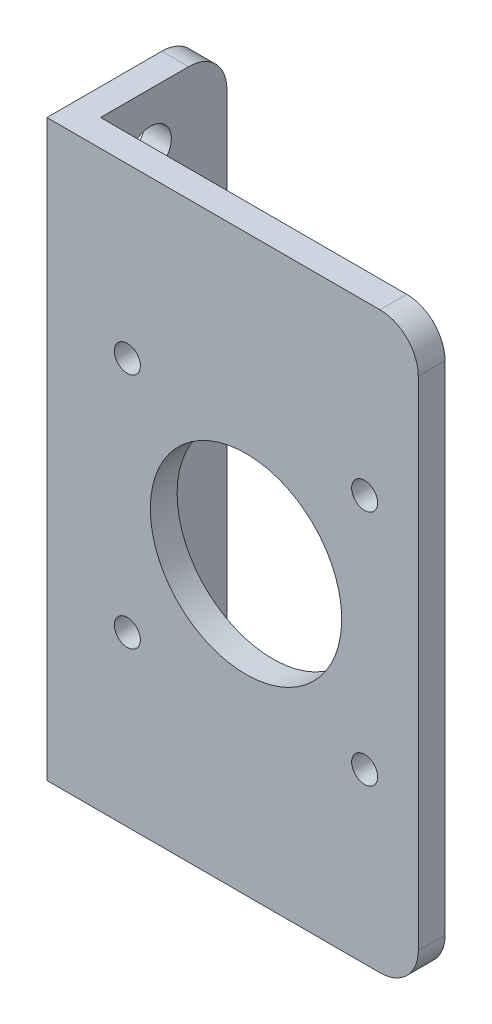
ISO-10303-21;
HEADER;
FILE_DESCRIPTION(('STEP AP214'),'2;1');
FILE_NAME('part.step','',(''),(''),'','','');
FILE_SCHEMA(('AUTOMOTIVE_DESIGN { 1 0 10303 214 1 1 1 1 }'));
ENDSEC;
DATA;
#1=APPLICATION_CONTEXT('core data for automotive mechanical design processes');
#2=APPLICATION_PROTOCOL_DEFINITION('international standard','automotive_design',2000,#1);
#3=PRODUCT_CONTEXT('',#1,'mechanical');
#4=PRODUCT('Part','Part','',(#3));
#5=PRODUCT_RELATED_PRODUCT_CATEGORY('part','',(#4));
#6=PRODUCT_DEFINITION_FORMATION('','',#4);
#7=PRODUCT_DEFINITION_CONTEXT('part definition',#1,'design');
#8=PRODUCT_DEFINITION('design','',#6,#7);
#9=PRODUCT_DEFINITION_SHAPE('','',#8);
#10=(LENGTH_UNIT() NAMED_UNIT(*) SI_UNIT(.MILLI.,.METRE.));
#11=(NAMED_UNIT(*) PLANE_ANGLE_UNIT() SI_UNIT($,.RADIAN.));
#12=(NAMED_UNIT(*) SI_UNIT($,.STERADIAN.) SOLID_ANGLE_UNIT());
#13=UNCERTAINTY_MEASURE_WITH_UNIT(LENGTH_MEASURE(1.E-05),#10,'distance_accuracy_value','');
#14=(GEOMETRIC_REPRESENTATION_CONTEXT(3) GLOBAL_UNCERTAINTY_ASSIGNED_CONTEXT((#13)) GLOBAL_UNIT_ASSIGNED_CONTEXT((#10,
#11,#12)) REPRESENTATION_CONTEXT('',''));
#15=CARTESIAN_POINT('',(0.,0.,0.));
#16=DIRECTION('',(0.,0.,1.));
#17=DIRECTION('',(1.,0.,0.));
#18=AXIS2_PLACEMENT_3D('',#15,#16,#17);
#19=CARTESIAN_POINT('',(48.5,37.5,0.));
#20=DIRECTION('',(0.,0.,-1.));
#21=DIRECTION('',(-1.,0.,0.));
#22=AXIS2_PLACEMENT_3D('',#19,#20,#21);
#23=PLANE('',#22);
#24=CARTESIAN_POINT('',(26.,0.,0.));
#25=DIRECTION('',(0.,0.,-1.));
#26=DIRECTION('',(-1.,0.,0.));
#27=AXIS2_PLACEMENT_3D('',#24,#25,#26);
#28=CIRCLE('',#27,12.5);
#29=CARTESIAN_POINT('',(13.5,0.,0.));
#30=VERTEX_POINT('',#29);
#31=EDGE_CURVE('E294',#30,#30,#28,.T.);
#32=ORIENTED_EDGE('',*,*,#31,.T.);
#33=EDGE_LOOP('',(#32));
#34=FACE_BOUND('',#33,.T.);
#35=CARTESIAN_POINT('',(41.5,15.5,0.));
#36=DIRECTION('',(0.,0.,-1.));
#37=DIRECTION('',(-1.,0.,0.));
#38=AXIS2_PLACEMENT_3D('',#35,#36,#37);
#39=CIRCLE('',#38,1.7);
#40=CARTESIAN_POINT('',(39.8,15.5,0.));
#41=VERTEX_POINT('',#40);
#42=EDGE_CURVE('E301',#41,#41,#39,.T.);
#43=ORIENTED_EDGE('',*,*,#42,.T.);
#44=EDGE_LOOP('',(#43));
#45=FACE_BOUND('',#44,.T.);
#46=CARTESIAN_POINT('',(10.5,15.5,0.));
#47=DIRECTION('',(0.,0.,-1.));
#48=DIRECTION('',(-1.,0.,0.));
#49=AXIS2_PLACEMENT_3D('',#46,#47,#48);
#50=CIRCLE('',#49,1.7);
#51=CARTESIAN_POINT('',(8.8,15.5,0.));
#52=VERTEX_POINT('',#51);
#53=EDGE_CURVE('E307',#52,#52,#50,.T.);
#54=ORIENTED_EDGE('',*,*,#53,.T.);
#55=EDGE_LOOP('',(#54));
#56=FACE_BOUND('',#55,.T.);
#57=CARTESIAN_POINT('',(10.5,-15.5,0.));
#58=DIRECTION('',(0.,0.,-1.));
#59=DIRECTION('',(-1.,0.,0.));
#60=AXIS2_PLACEMENT_3D('',#57,#58,#59);
#61=CIRCLE('',#60,1.7);
#62=CARTESIAN_POINT('',(8.80000000000001,-15.5,0.));
#63=VERTEX_POINT('',#62);
#64=EDGE_CURVE('E313',#63,#63,#61,.T.);
#65=ORIENTED_EDGE('',*,*,#64,.T.);
#66=EDGE_LOOP('',(#65));
#67=FACE_BOUND('',#66,.T.);
#68=CARTESIAN_POINT('',(41.5,-15.5,0.));
#69=DIRECTION('',(0.,0.,-1.));
#70=DIRECTION('',(-1.,0.,0.));
#71=AXIS2_PLACEMENT_3D('',#68,#69,#70);
#72=CIRCLE('',#71,1.7);
#73=CARTESIAN_POINT('',(39.8,-15.5,0.));
#74=VERTEX_POINT('',#73);
#75=EDGE_CURVE('E147',#74,#74,#72,.T.);
#76=ORIENTED_EDGE('',*,*,#75,.T.);
#77=EDGE_LOOP('',(#76));
#78=FACE_BOUND('',#77,.T.);
#79=DIRECTION('',(1.,0.,0.));
#80=VECTOR('',#79,1.);
#81=CARTESIAN_POINT('',(48.5,-37.5,0.));
#82=LINE('',#81,#80);
#83=CARTESIAN_POINT('',(0.,-37.5,0.));
#84=VERTEX_POINT('',#83);
#85=CARTESIAN_POINT('',(43.5,-37.5,0.));
#86=VERTEX_POINT('',#85);
#87=EDGE_CURVE('E145',#84,#86,#82,.T.);
#88=ORIENTED_EDGE('',*,*,#87,.T.);
#89=CARTESIAN_POINT('',(43.5,-32.5,0.));
#90=DIRECTION('',(0.,0.,-1.));
#91=DIRECTION('',(-1.,0.,0.));
#92=AXIS2_PLACEMENT_3D('',#89,#90,#91);
#93=CIRCLE('',#92,5.);
#94=CARTESIAN_POINT('',(48.5,-32.5,0.));
#95=VERTEX_POINT('',#94);
#96=EDGE_CURVE('E11',#86,#95,#93,.F.);
#97=ORIENTED_EDGE('',*,*,#96,.T.);
#98=DIRECTION('',(0.,-1.,0.));
#99=VECTOR('',#98,1.);
#100=CARTESIAN_POINT('',(48.5,37.5,0.));
#101=LINE('',#100,#99);
#102=CARTESIAN_POINT('',(48.5,32.5,0.));
#103=VERTEX_POINT('',#102);
#104=EDGE_CURVE('E161',#103,#95,#101,.T.);
#105=ORIENTED_EDGE('',*,*,#104,.F.);
#106=CARTESIAN_POINT('',(43.5,32.5,0.));
#107=DIRECTION('',(0.,0.,-1.));
#108=DIRECTION('',(-1.,0.,0.));
#109=AXIS2_PLACEMENT_3D('',#106,#107,#108);
#110=CIRCLE('',#109,5.);
#111=CARTESIAN_POINT('',(43.5,37.5,0.));
#112=VERTEX_POINT('',#111);
#113=EDGE_CURVE('E40',#103,#112,#110,.F.);
#114=ORIENTED_EDGE('',*,*,#113,.T.);
#115=DIRECTION('',(1.,0.,0.));
#116=VECTOR('',#115,1.);
#117=CARTESIAN_POINT('',(48.5,37.5,0.));
#118=LINE('',#117,#116);
#119=CARTESIAN_POINT('',(0.,37.5,0.));
#120=VERTEX_POINT('',#119);
#121=EDGE_CURVE('E121',#120,#112,#118,.T.);
#122=ORIENTED_EDGE('',*,*,#121,.F.);
#123=DIRECTION('',(0.,-1.,0.));
#124=VECTOR('',#123,1.);
#125=CARTESIAN_POINT('',(0.,37.5,0.));
#126=LINE('',#125,#124);
#127=EDGE_CURVE('E141',#120,#84,#126,.T.);
#128=ORIENTED_EDGE('',*,*,#127,.T.);
#129=EDGE_LOOP('',(#88,#97,#105,#114,#122,#128));
#130=FACE_BOUND('',#129,.T.);
#131=ADVANCED_FACE('F32',(#34,#45,#56,#67,#78,#130),#23,.F.);
#132=CARTESIAN_POINT('',(48.5,37.5,-3.5));
#133=DIRECTION('',(-1.,0.,0.));
#134=DIRECTION('',(0.,0.,1.));
#135=AXIS2_PLACEMENT_3D('',#132,#133,#134);
#136=PLANE('',#135);
#137=ORIENTED_EDGE('',*,*,#104,.T.);
#138=DIRECTION('',(0.,0.,-1.));
#139=VECTOR('',#138,1.);
#140=CARTESIAN_POINT('',(48.5,-32.5,-3.5));
#141=LINE('',#140,#139);
#142=CARTESIAN_POINT('',(48.5,-32.5,-3.5));
#143=VERTEX_POINT('',#142);
#144=EDGE_CURVE('E183',#95,#143,#141,.T.);
#145=ORIENTED_EDGE('',*,*,#144,.T.);
#146=DIRECTION('',(0.,-1.,0.));
#147=VECTOR('',#146,1.);
#148=CARTESIAN_POINT('',(48.5,37.5,-3.5));
#149=LINE('',#148,#147);
#150=CARTESIAN_POINT('',(48.5,32.5,-3.5));
#151=VERTEX_POINT('',#150);
#152=EDGE_CURVE('E132',#151,#143,#149,.T.);
#153=ORIENTED_EDGE('',*,*,#152,.F.);
#154=DIRECTION('',(0.,0.,-1.));
#155=VECTOR('',#154,1.);
#156=CARTESIAN_POINT('',(48.5,32.5,-3.5));
#157=LINE('',#156,#155);
#158=EDGE_CURVE('E52',#151,#103,#157,.F.);
#159=ORIENTED_EDGE('',*,*,#158,.T.);
#160=EDGE_LOOP('',(#137,#145,#153,#159));
#161=FACE_BOUND('',#160,.T.);
#162=ADVANCED_FACE('F194',(#161),#136,.F.);
#163=CARTESIAN_POINT('',(3.5,37.5,-3.5));
#164=DIRECTION('',(0.,0.,1.));
#165=DIRECTION('',(1.,0.,0.));
#166=AXIS2_PLACEMENT_3D('',#163,#164,#165);
#167=PLANE('',#166);
#168=CARTESIAN_POINT('',(26.,0.,-3.5));
#169=DIRECTION('',(0.,0.,-1.));
#170=DIRECTION('',(-1.,0.,0.));
#171=AXIS2_PLACEMENT_3D('',#168,#169,#170);
#172=CIRCLE('',#171,12.5);
#173=CARTESIAN_POINT('',(13.5,0.,-3.5));
#174=VERTEX_POINT('',#173);
#175=EDGE_CURVE('E293',#174,#174,#172,.T.);
#176=ORIENTED_EDGE('',*,*,#175,.F.);
#177=EDGE_LOOP('',(#176));
#178=FACE_BOUND('',#177,.T.);
#179=CARTESIAN_POINT('',(41.5,15.5,-3.5));
#180=DIRECTION('',(0.,0.,-1.));
#181=DIRECTION('',(-1.,0.,0.));
#182=AXIS2_PLACEMENT_3D('',#179,#180,#181);
#183=CIRCLE('',#182,1.7);
#184=CARTESIAN_POINT('',(39.8,15.5,-3.5));
#185=VERTEX_POINT('',#184);
#186=EDGE_CURVE('E296',#185,#185,#183,.T.);
#187=ORIENTED_EDGE('',*,*,#186,.F.);
#188=EDGE_LOOP('',(#187));
#189=FACE_BOUND('',#188,.T.);
#190=CARTESIAN_POINT('',(10.5,15.5,-3.5));
#191=DIRECTION('',(0.,0.,-1.));
#192=DIRECTION('',(-1.,0.,0.));
#193=AXIS2_PLACEMENT_3D('',#190,#191,#192);
#194=CIRCLE('',#193,1.7);
#195=CARTESIAN_POINT('',(8.8,15.5,-3.5));
#196=VERTEX_POINT('',#195);
#197=EDGE_CURVE('E304',#196,#196,#194,.T.);
#198=ORIENTED_EDGE('',*,*,#197,.F.);
#199=EDGE_LOOP('',(#198));
#200=FACE_BOUND('',#199,.T.);
#201=CARTESIAN_POINT('',(10.5,-15.5,-3.5));
#202=DIRECTION('',(0.,0.,-1.));
#203=DIRECTION('',(-1.,0.,0.));
#204=AXIS2_PLACEMENT_3D('',#201,#202,#203);
#205=CIRCLE('',#204,1.7);
#206=CARTESIAN_POINT('',(8.80000000000001,-15.5,-3.5));
#207=VERTEX_POINT('',#206);
#208=EDGE_CURVE('E310',#207,#207,#205,.T.);
#209=ORIENTED_EDGE('',*,*,#208,.F.);
#210=EDGE_LOOP('',(#209));
#211=FACE_BOUND('',#210,.T.);
#212=CARTESIAN_POINT('',(41.5,-15.5,-3.5));
#213=DIRECTION('',(0.,0.,-1.));
#214=DIRECTION('',(-1.,0.,0.));
#215=AXIS2_PLACEMENT_3D('',#212,#213,#214);
#216=CIRCLE('',#215,1.7);
#217=CARTESIAN_POINT('',(39.8,-15.5,-3.5));
#218=VERTEX_POINT('',#217);
#219=EDGE_CURVE('E316',#218,#218,#216,.T.);
#220=ORIENTED_EDGE('',*,*,#219,.F.);
#221=EDGE_LOOP('',(#220));
#222=FACE_BOUND('',#221,.T.);
#223=ORIENTED_EDGE('',*,*,#152,.T.);
#224=CARTESIAN_POINT('',(43.5,-32.5,-3.5));
#225=DIRECTION('',(0.,0.,1.));
#226=DIRECTION('',(1.,0.,0.));
#227=AXIS2_PLACEMENT_3D('',#224,#225,#226);
#228=CIRCLE('',#227,5.);
#229=CARTESIAN_POINT('',(43.5,-37.5,-3.5));
#230=VERTEX_POINT('',#229);
#231=EDGE_CURVE('E188',#143,#230,#228,.F.);
#232=ORIENTED_EDGE('',*,*,#231,.T.);
#233=DIRECTION('',(-1.,0.,0.));
#234=VECTOR('',#233,1.);
#235=CARTESIAN_POINT('',(3.5,-37.5,-3.5));
#236=LINE('',#235,#234);
#237=CARTESIAN_POINT('',(3.5,-37.5,-3.5));
#238=VERTEX_POINT('',#237);
#239=EDGE_CURVE('E128',#230,#238,#236,.T.);
#240=ORIENTED_EDGE('',*,*,#239,.T.);
#241=DIRECTION('',(0.,-1.,0.));
#242=VECTOR('',#241,1.);
#243=CARTESIAN_POINT('',(3.5,37.5,-3.5));
#244=LINE('',#243,#242);
#245=CARTESIAN_POINT('',(3.5,37.5,-3.5));
#246=VERTEX_POINT('',#245);
#247=EDGE_CURVE('E124',#246,#238,#244,.T.);
#248=ORIENTED_EDGE('',*,*,#247,.F.);
#249=DIRECTION('',(-1.,0.,0.));
#250=VECTOR('',#249,1.);
#251=CARTESIAN_POINT('',(3.5,37.5,-3.5));
#252=LINE('',#251,#250);
#253=CARTESIAN_POINT('',(43.5,37.5,-3.5));
#254=VERTEX_POINT('',#253);
#255=EDGE_CURVE('E110',#254,#246,#252,.T.);
#256=ORIENTED_EDGE('',*,*,#255,.F.);
#257=CARTESIAN_POINT('',(43.5,32.5,-3.5));
#258=DIRECTION('',(0.,0.,1.));
#259=DIRECTION('',(1.,0.,0.));
#260=AXIS2_PLACEMENT_3D('',#257,#258,#259);
#261=CIRCLE('',#260,5.);
#262=EDGE_CURVE('E186',#254,#151,#261,.F.);
#263=ORIENTED_EDGE('',*,*,#262,.T.);
#264=EDGE_LOOP('',(#223,#232,#240,#248,#256,#263));
#265=FACE_BOUND('',#264,.T.);
#266=ADVANCED_FACE('F126',(#178,#189,#200,#211,#222,#265),#167,.F.);
#267=CARTESIAN_POINT('',(3.5,37.5,-20.));
#268=DIRECTION('',(-1.,0.,0.));
#269=DIRECTION('',(0.,0.,1.));
#270=AXIS2_PLACEMENT_3D('',#267,#268,#269);
#271=PLANE('',#270);
#272=CARTESIAN_POINT('',(3.5,30.5,-9.99999999999999));
#273=DIRECTION('',(-1.,0.,0.));
#274=DIRECTION('',(0.,0.,1.));
#275=AXIS2_PLACEMENT_3D('',#272,#273,#274);
#276=CIRCLE('',#275,2.74999999999999);
#277=CARTESIAN_POINT('',(3.5,30.5,-7.25));
#278=VERTEX_POINT('',#277);
#279=EDGE_CURVE('E283',#278,#278,#276,.T.);
#280=ORIENTED_EDGE('',*,*,#279,.T.);
#281=EDGE_LOOP('',(#280));
#282=FACE_BOUND('',#281,.T.);
#283=CARTESIAN_POINT('',(3.5,-30.5,-9.99999999999999));
#284=DIRECTION('',(-1.,0.,0.));
#285=DIRECTION('',(0.,0.,1.));
#286=AXIS2_PLACEMENT_3D('',#283,#284,#285);
#287=CIRCLE('',#286,2.74999999999999);
#288=CARTESIAN_POINT('',(3.5,-30.5,-7.25));
#289=VERTEX_POINT('',#288);
#290=EDGE_CURVE('E287',#289,#289,#287,.T.);
#291=ORIENTED_EDGE('',*,*,#290,.T.);
#292=EDGE_LOOP('',(#291));
#293=FACE_BOUND('',#292,.T.);
#294=DIRECTION('',(0.,0.,-1.));
#295=VECTOR('',#294,1.);
#296=CARTESIAN_POINT('',(3.5,-37.5,-20.));
#297=LINE('',#296,#295);
#298=CARTESIAN_POINT('',(3.5,-37.5,-15.));
#299=VERTEX_POINT('',#298);
#300=EDGE_CURVE('E149',#238,#299,#297,.T.);
#301=ORIENTED_EDGE('',*,*,#300,.T.);
#302=CARTESIAN_POINT('',(3.5,-32.5,-15.));
#303=DIRECTION('',(-1.,0.,0.));
#304=DIRECTION('',(0.,0.,1.));
#305=AXIS2_PLACEMENT_3D('',#302,#303,#304);
#306=CIRCLE('',#305,5.);
#307=CARTESIAN_POINT('',(3.5,-32.5,-20.));
#308=VERTEX_POINT('',#307);
#309=EDGE_CURVE('E177',#299,#308,#306,.F.);
#310=ORIENTED_EDGE('',*,*,#309,.T.);
#311=DIRECTION('',(0.,-1.,0.));
#312=VECTOR('',#311,1.);
#313=CARTESIAN_POINT('',(3.5,37.5,-20.));
#314=LINE('',#313,#312);
#315=CARTESIAN_POINT('',(3.5,32.5,-20.));
#316=VERTEX_POINT('',#315);
#317=EDGE_CURVE('E133',#316,#308,#314,.T.);
#318=ORIENTED_EDGE('',*,*,#317,.F.);
#319=CARTESIAN_POINT('',(3.5,32.5,-15.));
#320=DIRECTION('',(-1.,0.,0.));
#321=DIRECTION('',(0.,0.,1.));
#322=AXIS2_PLACEMENT_3D('',#319,#320,#321);
#323=CIRCLE('',#322,5.);
#324=CARTESIAN_POINT('',(3.5,37.5,-15.));
#325=VERTEX_POINT('',#324);
#326=EDGE_CURVE('E138',#316,#325,#323,.F.);
#327=ORIENTED_EDGE('',*,*,#326,.T.);
#328=DIRECTION('',(0.,0.,-1.));
#329=VECTOR('',#328,1.);
#330=CARTESIAN_POINT('',(3.5,37.5,-20.));
#331=LINE('',#330,#329);
#332=EDGE_CURVE('E115',#246,#325,#331,.T.);
#333=ORIENTED_EDGE('',*,*,#332,.F.);
#334=ORIENTED_EDGE('',*,*,#247,.T.);
#335=EDGE_LOOP('',(#301,#310,#318,#327,#333,#334));
#336=FACE_BOUND('',#335,.T.);
#337=ADVANCED_FACE('F135',(#282,#293,#336),#271,.F.);
#338=CARTESIAN_POINT('',(0.,37.5,-20.));
#339=DIRECTION('',(0.,0.,1.));
#340=DIRECTION('',(1.,0.,0.));
#341=AXIS2_PLACEMENT_3D('',#338,#339,#340);
#342=PLANE('',#341);
#343=ORIENTED_EDGE('',*,*,#317,.T.);
#344=DIRECTION('',(-1.,0.,0.));
#345=VECTOR('',#344,1.);
#346=CARTESIAN_POINT('',(0.,-32.5,-20.));
#347=LINE('',#346,#345);
#348=CARTESIAN_POINT('',(0.,-32.5,-20.));
#349=VERTEX_POINT('',#348);
#350=EDGE_CURVE('E165',#308,#349,#347,.T.);
#351=ORIENTED_EDGE('',*,*,#350,.T.);
#352=DIRECTION('',(0.,-1.,0.));
#353=VECTOR('',#352,1.);
#354=CARTESIAN_POINT('',(0.,37.5,-20.));
#355=LINE('',#354,#353);
#356=CARTESIAN_POINT('',(0.,32.5,-20.));
#357=VERTEX_POINT('',#356);
#358=EDGE_CURVE('E155',#357,#349,#355,.T.);
#359=ORIENTED_EDGE('',*,*,#358,.F.);
#360=DIRECTION('',(-1.,0.,0.));
#361=VECTOR('',#360,1.);
#362=CARTESIAN_POINT('',(0.,32.5,-20.));
#363=LINE('',#362,#361);
#364=EDGE_CURVE('E163',#357,#316,#363,.F.);
#365=ORIENTED_EDGE('',*,*,#364,.T.);
#366=EDGE_LOOP('',(#343,#351,#359,#365));
#367=FACE_BOUND('',#366,.T.);
#368=ADVANCED_FACE('F210',(#367),#342,.F.);
#369=CARTESIAN_POINT('',(0.,37.5,0.));
#370=DIRECTION('',(1.,0.,0.));
#371=DIRECTION('',(0.,0.,-1.));
#372=AXIS2_PLACEMENT_3D('',#369,#370,#371);
#373=PLANE('',#372);
#374=CARTESIAN_POINT('',(0.,30.5,-9.99999999999999));
#375=DIRECTION('',(-1.,0.,0.));
#376=DIRECTION('',(0.,0.,1.));
#377=AXIS2_PLACEMENT_3D('',#374,#375,#376);
#378=CIRCLE('',#377,2.75);
#379=CARTESIAN_POINT('',(0.,30.5,-7.24999999999999));
#380=VERTEX_POINT('',#379);
#381=EDGE_CURVE('E280',#380,#380,#378,.T.);
#382=ORIENTED_EDGE('',*,*,#381,.F.);
#383=EDGE_LOOP('',(#382));
#384=FACE_BOUND('',#383,.T.);
#385=CARTESIAN_POINT('',(0.,-30.5,-9.99999999999999));
#386=DIRECTION('',(-1.,0.,0.));
#387=DIRECTION('',(0.,0.,1.));
#388=AXIS2_PLACEMENT_3D('',#385,#386,#387);
#389=CIRCLE('',#388,2.75);
#390=CARTESIAN_POINT('',(0.,-30.5,-7.24999999999999));
#391=VERTEX_POINT('',#390);
#392=EDGE_CURVE('E284',#391,#391,#389,.T.);
#393=ORIENTED_EDGE('',*,*,#392,.F.);
#394=EDGE_LOOP('',(#393));
#395=FACE_BOUND('',#394,.T.);
#396=ORIENTED_EDGE('',*,*,#358,.T.);
#397=CARTESIAN_POINT('',(0.,-32.5,-15.));
#398=DIRECTION('',(1.,0.,0.));
#399=DIRECTION('',(0.,0.,-1.));
#400=AXIS2_PLACEMENT_3D('',#397,#398,#399);
#401=CIRCLE('',#400,5.);
#402=CARTESIAN_POINT('',(0.,-37.5,-15.));
#403=VERTEX_POINT('',#402);
#404=EDGE_CURVE('E170',#349,#403,#401,.F.);
#405=ORIENTED_EDGE('',*,*,#404,.T.);
#406=DIRECTION('',(0.,0.,1.));
#407=VECTOR('',#406,1.);
#408=CARTESIAN_POINT('',(0.,-37.5,0.));
#409=LINE('',#408,#407);
#410=EDGE_CURVE('E151',#403,#84,#409,.T.);
#411=ORIENTED_EDGE('',*,*,#410,.T.);
#412=ORIENTED_EDGE('',*,*,#127,.F.);
#413=DIRECTION('',(0.,0.,1.));
#414=VECTOR('',#413,1.);
#415=CARTESIAN_POINT('',(0.,37.5,0.));
#416=LINE('',#415,#414);
#417=CARTESIAN_POINT('',(0.,37.5,-15.));
#418=VERTEX_POINT('',#417);
#419=EDGE_CURVE('E139',#418,#120,#416,.T.);
#420=ORIENTED_EDGE('',*,*,#419,.F.);
#421=CARTESIAN_POINT('',(0.,32.5,-15.));
#422=DIRECTION('',(1.,0.,0.));
#423=DIRECTION('',(0.,0.,-1.));
#424=AXIS2_PLACEMENT_3D('',#421,#422,#423);
#425=CIRCLE('',#424,5.);
#426=EDGE_CURVE('E168',#418,#357,#425,.F.);
#427=ORIENTED_EDGE('',*,*,#426,.T.);
#428=EDGE_LOOP('',(#396,#405,#411,#412,#420,#427));
#429=FACE_BOUND('',#428,.T.);
#430=ADVANCED_FACE('F213',(#384,#395,#429),#373,.F.);
#431=CARTESIAN_POINT('',(0.,37.5,0.));
#432=DIRECTION('',(0.,-1.,0.));
#433=DIRECTION('',(0.,0.,-1.));
#434=AXIS2_PLACEMENT_3D('',#431,#432,#433);
#435=PLANE('',#434);
#436=ORIENTED_EDGE('',*,*,#332,.T.);
#437=DIRECTION('',(-1.,0.,0.));
#438=VECTOR('',#437,1.);
#439=CARTESIAN_POINT('',(0.,37.5,-15.));
#440=LINE('',#439,#438);
#441=EDGE_CURVE('E180',#325,#418,#440,.T.);
#442=ORIENTED_EDGE('',*,*,#441,.T.);
#443=ORIENTED_EDGE('',*,*,#419,.T.);
#444=ORIENTED_EDGE('',*,*,#121,.T.);
#445=DIRECTION('',(0.,0.,-1.));
#446=VECTOR('',#445,1.);
#447=CARTESIAN_POINT('',(43.5,37.5,0.));
#448=LINE('',#447,#446);
#449=EDGE_CURVE('E119',#112,#254,#448,.T.);
#450=ORIENTED_EDGE('',*,*,#449,.T.);
#451=ORIENTED_EDGE('',*,*,#255,.T.);
#452=EDGE_LOOP('',(#436,#442,#443,#444,#450,#451));
#453=FACE_BOUND('',#452,.T.);
#454=ADVANCED_FACE('F112',(#453),#435,.F.);
#455=CARTESIAN_POINT('',(0.,-37.5,0.));
#456=DIRECTION('',(0.,-1.,0.));
#457=DIRECTION('',(0.,0.,-1.));
#458=AXIS2_PLACEMENT_3D('',#455,#456,#457);
#459=PLANE('',#458);
#460=ORIENTED_EDGE('',*,*,#410,.F.);
#461=DIRECTION('',(-1.,0.,0.));
#462=VECTOR('',#461,1.);
#463=CARTESIAN_POINT('',(3.5,-37.5,-15.));
#464=LINE('',#463,#462);
#465=EDGE_CURVE('E174',#403,#299,#464,.F.);
#466=ORIENTED_EDGE('',*,*,#465,.T.);
#467=ORIENTED_EDGE('',*,*,#300,.F.);
#468=ORIENTED_EDGE('',*,*,#239,.F.);
#469=DIRECTION('',(0.,0.,-1.));
#470=VECTOR('',#469,1.);
#471=CARTESIAN_POINT('',(43.5,-37.5,0.));
#472=LINE('',#471,#470);
#473=EDGE_CURVE('E172',#230,#86,#472,.F.);
#474=ORIENTED_EDGE('',*,*,#473,.T.);
#475=ORIENTED_EDGE('',*,*,#87,.F.);
#476=EDGE_LOOP('',(#460,#466,#467,#468,#474,#475));
#477=FACE_BOUND('',#476,.T.);
#478=ADVANCED_FACE('F201',(#477),#459,.T.);
#479=CARTESIAN_POINT('',(41.5,-15.5,-3.5));
#480=DIRECTION('',(0.,0.,-1.));
#481=DIRECTION('',(-1.,0.,0.));
#482=AXIS2_PLACEMENT_3D('',#479,#480,#481);
#483=CYLINDRICAL_SURFACE('',#482,1.7);
#484=ORIENTED_EDGE('',*,*,#75,.F.);
#485=EDGE_LOOP('',(#484));
#486=FACE_BOUND('',#485,.T.);
#487=ORIENTED_EDGE('',*,*,#219,.T.);
#488=EDGE_LOOP('',(#487));
#489=FACE_BOUND('',#488,.T.);
#490=ADVANCED_FACE('F247',(#486,#489),#483,.F.);
#491=CARTESIAN_POINT('',(10.5,-15.5,-3.5));
#492=DIRECTION('',(0.,0.,-1.));
#493=DIRECTION('',(-1.,0.,0.));
#494=AXIS2_PLACEMENT_3D('',#491,#492,#493);
#495=CYLINDRICAL_SURFACE('',#494,1.7);
#496=ORIENTED_EDGE('',*,*,#64,.F.);
#497=EDGE_LOOP('',(#496));
#498=FACE_BOUND('',#497,.T.);
#499=ORIENTED_EDGE('',*,*,#208,.T.);
#500=EDGE_LOOP('',(#499));
#501=FACE_BOUND('',#500,.T.);
#502=ADVANCED_FACE('F252',(#498,#501),#495,.F.);
#503=CARTESIAN_POINT('',(10.5,15.5,-3.5));
#504=DIRECTION('',(0.,0.,-1.));
#505=DIRECTION('',(-1.,0.,0.));
#506=AXIS2_PLACEMENT_3D('',#503,#504,#505);
#507=CYLINDRICAL_SURFACE('',#506,1.7);
#508=ORIENTED_EDGE('',*,*,#53,.F.);
#509=EDGE_LOOP('',(#508));
#510=FACE_BOUND('',#509,.T.);
#511=ORIENTED_EDGE('',*,*,#197,.T.);
#512=EDGE_LOOP('',(#511));
#513=FACE_BOUND('',#512,.T.);
#514=ADVANCED_FACE('F256',(#510,#513),#507,.F.);
#515=CARTESIAN_POINT('',(41.5,15.5,-3.5));
#516=DIRECTION('',(0.,0.,-1.));
#517=DIRECTION('',(-1.,0.,0.));
#518=AXIS2_PLACEMENT_3D('',#515,#516,#517);
#519=CYLINDRICAL_SURFACE('',#518,1.7);
#520=ORIENTED_EDGE('',*,*,#42,.F.);
#521=EDGE_LOOP('',(#520));
#522=FACE_BOUND('',#521,.T.);
#523=ORIENTED_EDGE('',*,*,#186,.T.);
#524=EDGE_LOOP('',(#523));
#525=FACE_BOUND('',#524,.T.);
#526=ADVANCED_FACE('F260',(#522,#525),#519,.F.);
#527=CARTESIAN_POINT('',(26.,0.,0.));
#528=DIRECTION('',(0.,0.,-1.));
#529=DIRECTION('',(-1.,0.,0.));
#530=AXIS2_PLACEMENT_3D('',#527,#528,#529);
#531=CYLINDRICAL_SURFACE('',#530,12.5);
#532=ORIENTED_EDGE('',*,*,#31,.F.);
#533=EDGE_LOOP('',(#532));
#534=FACE_BOUND('',#533,.T.);
#535=ORIENTED_EDGE('',*,*,#175,.T.);
#536=EDGE_LOOP('',(#535));
#537=FACE_BOUND('',#536,.T.);
#538=ADVANCED_FACE('F264',(#534,#537),#531,.F.);
#539=CARTESIAN_POINT('',(0.,-30.5,-9.99999999999999));
#540=DIRECTION('',(-1.,0.,0.));
#541=DIRECTION('',(0.,0.,1.));
#542=AXIS2_PLACEMENT_3D('',#539,#540,#541);
#543=CYLINDRICAL_SURFACE('',#542,2.74999999999999);
#544=ORIENTED_EDGE('',*,*,#392,.T.);
#545=EDGE_LOOP('',(#544));
#546=FACE_BOUND('',#545,.T.);
#547=ORIENTED_EDGE('',*,*,#290,.F.);
#548=EDGE_LOOP('',(#547));
#549=FACE_BOUND('',#548,.T.);
#550=ADVANCED_FACE('F268',(#546,#549),#543,.F.);
#551=CARTESIAN_POINT('',(0.,30.5,-9.99999999999999));
#552=DIRECTION('',(-1.,0.,0.));
#553=DIRECTION('',(0.,0.,1.));
#554=AXIS2_PLACEMENT_3D('',#551,#552,#553);
#555=CYLINDRICAL_SURFACE('',#554,2.74999999999999);
#556=ORIENTED_EDGE('',*,*,#381,.T.);
#557=EDGE_LOOP('',(#556));
#558=FACE_BOUND('',#557,.T.);
#559=ORIENTED_EDGE('',*,*,#279,.F.);
#560=EDGE_LOOP('',(#559));
#561=FACE_BOUND('',#560,.T.);
#562=ADVANCED_FACE('F222',(#558,#561),#555,.F.);
#563=CARTESIAN_POINT('',(0.,-32.5,-15.));
#564=DIRECTION('',(1.,0.,0.));
#565=DIRECTION('',(0.,0.,-1.));
#566=AXIS2_PLACEMENT_3D('',#563,#564,#565);
#567=CYLINDRICAL_SURFACE('',#566,5.);
#568=ORIENTED_EDGE('',*,*,#309,.F.);
#569=ORIENTED_EDGE('',*,*,#465,.F.);
#570=ORIENTED_EDGE('',*,*,#404,.F.);
#571=ORIENTED_EDGE('',*,*,#350,.F.);
#572=EDGE_LOOP('',(#568,#569,#570,#571));
#573=FACE_BOUND('',#572,.T.);
#574=ADVANCED_FACE('F207',(#573),#567,.T.);
#575=CARTESIAN_POINT('',(0.,32.5,-15.));
#576=DIRECTION('',(-1.,0.,0.));
#577=DIRECTION('',(0.,0.,1.));
#578=AXIS2_PLACEMENT_3D('',#575,#576,#577);
#579=CYLINDRICAL_SURFACE('',#578,5.);
#580=ORIENTED_EDGE('',*,*,#326,.F.);
#581=ORIENTED_EDGE('',*,*,#364,.F.);
#582=ORIENTED_EDGE('',*,*,#426,.F.);
#583=ORIENTED_EDGE('',*,*,#441,.F.);
#584=EDGE_LOOP('',(#580,#581,#582,#583));
#585=FACE_BOUND('',#584,.T.);
#586=ADVANCED_FACE('F215',(#585),#579,.T.);
#587=CARTESIAN_POINT('',(43.5,-32.5,-3.5));
#588=DIRECTION('',(0.,0.,1.));
#589=DIRECTION('',(1.,0.,0.));
#590=AXIS2_PLACEMENT_3D('',#587,#588,#589);
#591=CYLINDRICAL_SURFACE('',#590,5.);
#592=ORIENTED_EDGE('',*,*,#96,.F.);
#593=ORIENTED_EDGE('',*,*,#473,.F.);
#594=ORIENTED_EDGE('',*,*,#231,.F.);
#595=ORIENTED_EDGE('',*,*,#144,.F.);
#596=EDGE_LOOP('',(#592,#593,#594,#595));
#597=FACE_BOUND('',#596,.T.);
#598=ADVANCED_FACE('F197',(#597),#591,.T.);
#599=CARTESIAN_POINT('',(43.5,32.5,0.));
#600=DIRECTION('',(0.,0.,-1.));
#601=DIRECTION('',(-1.,0.,0.));
#602=AXIS2_PLACEMENT_3D('',#599,#600,#601);
#603=CYLINDRICAL_SURFACE('',#602,5.);
#604=ORIENTED_EDGE('',*,*,#113,.F.);
#605=ORIENTED_EDGE('',*,*,#158,.F.);
#606=ORIENTED_EDGE('',*,*,#262,.F.);
#607=ORIENTED_EDGE('',*,*,#449,.F.);
#608=EDGE_LOOP('',(#604,#605,#606,#607));
#609=FACE_BOUND('',#608,.T.);
#610=ADVANCED_FACE('F34',(#609),#603,.T.);
#611=CLOSED_SHELL('',(#131,#162,#266,#337,#368,#430,#454,#478,#490,#502,#514,#526,#538,#550,
#562,#574,#586,#598,#610));
#612=MANIFOLD_SOLID_BREP('B2',#611);
#613=ADVANCED_BREP_SHAPE_REPRESENTATION('',(#18,#612),#14);
#614=SHAPE_DEFINITION_REPRESENTATION(#9,#613);
ENDSEC;
END-ISO-10303-21;
